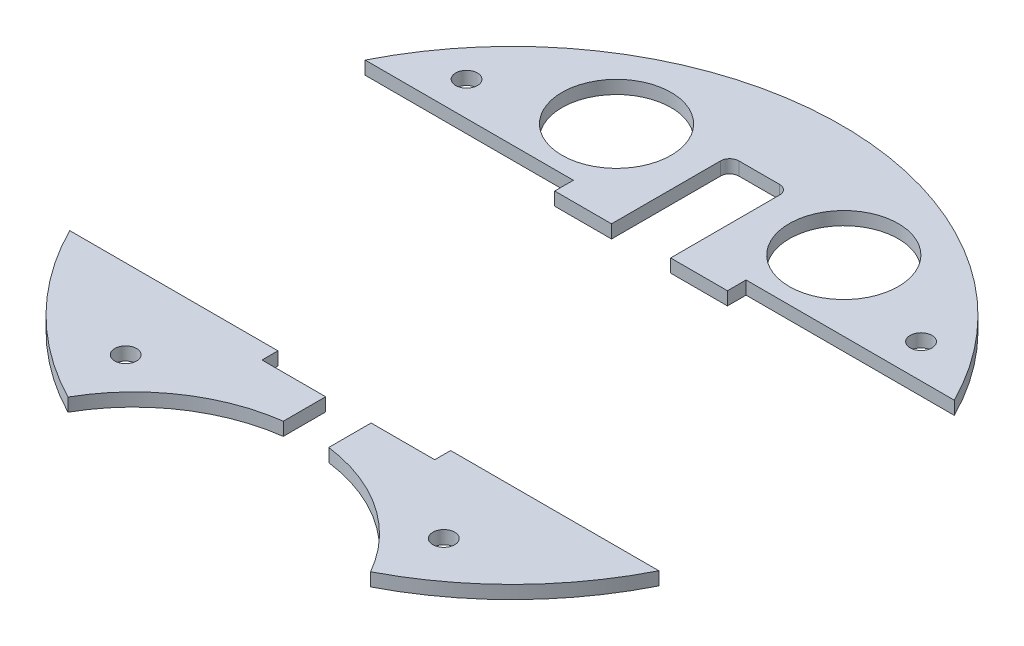
ISO-10303-21;
HEADER;
FILE_DESCRIPTION(('STEP AP214'),'2;1');
FILE_NAME('part.step','',(''),(''),'','','');
FILE_SCHEMA(('AUTOMOTIVE_DESIGN { 1 0 10303 214 1 1 1 1 }'));
ENDSEC;
DATA;
#1=APPLICATION_CONTEXT('core data for automotive mechanical design processes');
#2=APPLICATION_PROTOCOL_DEFINITION('international standard','automotive_design',2000,#1);
#3=PRODUCT_CONTEXT('',#1,'mechanical');
#4=PRODUCT('Part','Part','',(#3));
#5=PRODUCT_RELATED_PRODUCT_CATEGORY('part','',(#4));
#6=PRODUCT_DEFINITION_FORMATION('','',#4);
#7=PRODUCT_DEFINITION_CONTEXT('part definition',#1,'design');
#8=PRODUCT_DEFINITION('design','',#6,#7);
#9=PRODUCT_DEFINITION_SHAPE('','',#8);
#10=(LENGTH_UNIT() NAMED_UNIT(*) SI_UNIT(.MILLI.,.METRE.));
#11=(NAMED_UNIT(*) PLANE_ANGLE_UNIT() SI_UNIT($,.RADIAN.));
#12=(NAMED_UNIT(*) SI_UNIT($,.STERADIAN.) SOLID_ANGLE_UNIT());
#13=UNCERTAINTY_MEASURE_WITH_UNIT(LENGTH_MEASURE(1.E-05),#10,'distance_accuracy_value','');
#14=(GEOMETRIC_REPRESENTATION_CONTEXT(3) GLOBAL_UNCERTAINTY_ASSIGNED_CONTEXT((#13)) GLOBAL_UNIT_ASSIGNED_CONTEXT((#10,
#11,#12)) REPRESENTATION_CONTEXT('',''));
#15=CARTESIAN_POINT('',(0.,0.,0.));
#16=DIRECTION('',(0.,0.,1.));
#17=DIRECTION('',(1.,0.,0.));
#18=AXIS2_PLACEMENT_3D('',#15,#16,#17);
#19=CARTESIAN_POINT('',(0.,2.9,41.6198998188017));
#20=DIRECTION('',(0.,1.,0.));
#21=DIRECTION('',(0.,0.,1.));
#22=AXIS2_PLACEMENT_3D('',#19,#20,#21);
#23=PLANE('',#22);
#24=DIRECTION('',(0.,0.,1.));
#25=VECTOR('',#24,1.);
#26=CARTESIAN_POINT('',(-5.,2.9,41.6198998188017));
#27=LINE('',#26,#25);
#28=CARTESIAN_POINT('',(-5.,2.9,36.));
#29=VERTEX_POINT('',#28);
#30=CARTESIAN_POINT('',(-5.,2.9,45.3180051125549));
#31=VERTEX_POINT('',#30);
#32=EDGE_CURVE('E12',#29,#31,#27,.T.);
#33=ORIENTED_EDGE('',*,*,#32,.F.);
#34=DIRECTION('',(1.,0.,0.));
#35=VECTOR('',#34,1.);
#36=CARTESIAN_POINT('',(-19.,2.9,36.));
#37=LINE('',#36,#35);
#38=CARTESIAN_POINT('',(-19.,2.9,36.));
#39=VERTEX_POINT('',#38);
#40=EDGE_CURVE('E108',#39,#29,#37,.T.);
#41=ORIENTED_EDGE('',*,*,#40,.F.);
#42=DIRECTION('',(0.,0.,1.));
#43=VECTOR('',#42,1.);
#44=CARTESIAN_POINT('',(-19.,2.9,-28.4));
#45=LINE('',#44,#43);
#46=CARTESIAN_POINT('',(-19.,2.9,32.5));
#47=VERTEX_POINT('',#46);
#48=EDGE_CURVE('E149',#47,#39,#45,.T.);
#49=ORIENTED_EDGE('',*,*,#48,.F.);
#50=DIRECTION('',(1.,0.,0.));
#51=VECTOR('',#50,1.);
#52=CARTESIAN_POINT('',(-72.5,2.9,32.5));
#53=LINE('',#52,#51);
#54=CARTESIAN_POINT('',(-64.8074069840786,2.9,32.5));
#55=VERTEX_POINT('',#54);
#56=EDGE_CURVE('E52',#55,#47,#53,.T.);
#57=ORIENTED_EDGE('',*,*,#56,.F.);
#58=CARTESIAN_POINT('',(0.,2.9,0.));
#59=DIRECTION('',(0.,1.,0.));
#60=DIRECTION('',(0.,0.,1.));
#61=AXIS2_PLACEMENT_3D('',#58,#59,#60);
#62=CIRCLE('',#61,72.5);
#63=CARTESIAN_POINT('',(-33.2911053697012,2.9,64.4045984636458));
#64=VERTEX_POINT('',#63);
#65=EDGE_CURVE('E122',#55,#64,#62,.T.);
#66=ORIENTED_EDGE('',*,*,#65,.T.);
#67=CARTESIAN_POINT('',(0.,2.9,83.2397996376034));
#68=DIRECTION('',(0.,-1.,0.));
#69=DIRECTION('',(0.,0.,1.));
#70=AXIS2_PLACEMENT_3D('',#67,#68,#69);
#71=CIRCLE('',#70,38.25);
#72=EDGE_CURVE('E47',#64,#31,#71,.T.);
#73=ORIENTED_EDGE('',*,*,#72,.T.);
#74=EDGE_LOOP('',(#33,#41,#49,#57,#66,#73));
#75=FACE_BOUND('',#74,.T.);
#76=CARTESIAN_POINT('',(-35.,2.9,50.));
#77=DIRECTION('',(0.,1.,0.));
#78=DIRECTION('',(0.,0.,1.));
#79=AXIS2_PLACEMENT_3D('',#76,#77,#78);
#80=CIRCLE('',#79,2.4);
#81=CARTESIAN_POINT('',(-35.,2.9,52.4));
#82=VERTEX_POINT('',#81);
#83=EDGE_CURVE('E140',#82,#82,#80,.T.);
#84=ORIENTED_EDGE('',*,*,#83,.F.);
#85=EDGE_LOOP('',(#84));
#86=FACE_BOUND('',#85,.T.);
#87=ADVANCED_FACE('F44',(#75,#86),#23,.T.);
#88=CARTESIAN_POINT('',(0.,0.,41.6198998188017));
#89=DIRECTION('',(0.,1.,0.));
#90=DIRECTION('',(0.,0.,1.));
#91=AXIS2_PLACEMENT_3D('',#88,#89,#90);
#92=PLANE('',#91);
#93=CARTESIAN_POINT('',(-35.,0.,50.));
#94=DIRECTION('',(0.,1.,0.));
#95=DIRECTION('',(0.,0.,1.));
#96=AXIS2_PLACEMENT_3D('',#93,#94,#95);
#97=CIRCLE('',#96,2.4);
#98=CARTESIAN_POINT('',(-35.,0.,52.4));
#99=VERTEX_POINT('',#98);
#100=EDGE_CURVE('E116',#99,#99,#97,.T.);
#101=ORIENTED_EDGE('',*,*,#100,.T.);
#102=EDGE_LOOP('',(#101));
#103=FACE_BOUND('',#102,.T.);
#104=DIRECTION('',(1.,0.,0.));
#105=VECTOR('',#104,1.);
#106=CARTESIAN_POINT('',(-19.,0.,36.));
#107=LINE('',#106,#105);
#108=CARTESIAN_POINT('',(-19.,0.,36.));
#109=VERTEX_POINT('',#108);
#110=CARTESIAN_POINT('',(-5.00000000000001,0.,36.));
#111=VERTEX_POINT('',#110);
#112=EDGE_CURVE('E100',#109,#111,#107,.T.);
#113=ORIENTED_EDGE('',*,*,#112,.T.);
#114=DIRECTION('',(0.,0.,1.));
#115=VECTOR('',#114,1.);
#116=CARTESIAN_POINT('',(-5.00000000000001,0.,0.));
#117=LINE('',#116,#115);
#118=CARTESIAN_POINT('',(-5.,0.,45.3180051125549));
#119=VERTEX_POINT('',#118);
#120=EDGE_CURVE('E91',#111,#119,#117,.T.);
#121=ORIENTED_EDGE('',*,*,#120,.T.);
#122=CARTESIAN_POINT('',(0.,0.,83.2397996376034));
#123=DIRECTION('',(0.,-1.,0.));
#124=DIRECTION('',(0.,0.,1.));
#125=AXIS2_PLACEMENT_3D('',#122,#123,#124);
#126=CIRCLE('',#125,38.25);
#127=CARTESIAN_POINT('',(-33.2911053697012,0.,64.4045984636458));
#128=VERTEX_POINT('',#127);
#129=EDGE_CURVE('E134',#128,#119,#126,.T.);
#130=ORIENTED_EDGE('',*,*,#129,.F.);
#131=CARTESIAN_POINT('',(0.,0.,0.));
#132=DIRECTION('',(0.,1.,0.));
#133=DIRECTION('',(0.,0.,1.));
#134=AXIS2_PLACEMENT_3D('',#131,#132,#133);
#135=CIRCLE('',#134,72.5);
#136=CARTESIAN_POINT('',(-64.8074069840786,0.,32.5));
#137=VERTEX_POINT('',#136);
#138=EDGE_CURVE('E142',#137,#128,#135,.T.);
#139=ORIENTED_EDGE('',*,*,#138,.F.);
#140=DIRECTION('',(1.,0.,0.));
#141=VECTOR('',#140,1.);
#142=CARTESIAN_POINT('',(-72.5,0.,32.5));
#143=LINE('',#142,#141);
#144=CARTESIAN_POINT('',(-19.,0.,32.5));
#145=VERTEX_POINT('',#144);
#146=EDGE_CURVE('E99',#137,#145,#143,.T.);
#147=ORIENTED_EDGE('',*,*,#146,.T.);
#148=DIRECTION('',(0.,0.,1.));
#149=VECTOR('',#148,1.);
#150=CARTESIAN_POINT('',(-19.,0.,-28.4));
#151=LINE('',#150,#149);
#152=EDGE_CURVE('E114',#145,#109,#151,.T.);
#153=ORIENTED_EDGE('',*,*,#152,.T.);
#154=EDGE_LOOP('',(#113,#121,#130,#139,#147,#153));
#155=FACE_BOUND('',#154,.T.);
#156=ADVANCED_FACE('F111',(#103,#155),#92,.F.);
#157=CARTESIAN_POINT('',(0.,2.9,83.2397996376034));
#158=DIRECTION('',(0.,-1.,0.));
#159=DIRECTION('',(0.,0.,-1.));
#160=AXIS2_PLACEMENT_3D('',#157,#158,#159);
#161=CYLINDRICAL_SURFACE('',#160,38.25);
#162=ORIENTED_EDGE('',*,*,#129,.T.);
#163=DIRECTION('',(0.,-1.,0.));
#164=VECTOR('',#163,1.);
#165=CARTESIAN_POINT('',(-5.,2.9,45.3180051125549));
#166=LINE('',#165,#164);
#167=EDGE_CURVE('E59',#119,#31,#166,.F.);
#168=ORIENTED_EDGE('',*,*,#167,.T.);
#169=ORIENTED_EDGE('',*,*,#72,.F.);
#170=DIRECTION('',(0.,-1.,0.));
#171=VECTOR('',#170,1.);
#172=CARTESIAN_POINT('',(-33.2911053697012,2.9,64.4045984636458));
#173=LINE('',#172,#171);
#174=EDGE_CURVE('E133',#64,#128,#173,.T.);
#175=ORIENTED_EDGE('',*,*,#174,.T.);
#176=EDGE_LOOP('',(#162,#168,#169,#175));
#177=FACE_BOUND('',#176,.T.);
#178=ADVANCED_FACE('F132',(#177),#161,.F.);
#179=CARTESIAN_POINT('',(-19.,0.,36.));
#180=DIRECTION('',(0.,0.,1.));
#181=DIRECTION('',(1.,0.,0.));
#182=AXIS2_PLACEMENT_3D('',#179,#180,#181);
#183=PLANE('',#182);
#184=ORIENTED_EDGE('',*,*,#40,.T.);
#185=DIRECTION('',(0.,-1.,0.));
#186=VECTOR('',#185,1.);
#187=CARTESIAN_POINT('',(-5.,0.,36.));
#188=LINE('',#187,#186);
#189=EDGE_CURVE('E94',#29,#111,#188,.T.);
#190=ORIENTED_EDGE('',*,*,#189,.T.);
#191=ORIENTED_EDGE('',*,*,#112,.F.);
#192=DIRECTION('',(0.,1.,0.));
#193=VECTOR('',#192,1.);
#194=CARTESIAN_POINT('',(-19.,0.,36.));
#195=LINE('',#194,#193);
#196=EDGE_CURVE('E109',#109,#39,#195,.T.);
#197=ORIENTED_EDGE('',*,*,#196,.T.);
#198=EDGE_LOOP('',(#184,#190,#191,#197));
#199=FACE_BOUND('',#198,.T.);
#200=ADVANCED_FACE('F105',(#199),#183,.F.);
#201=CARTESIAN_POINT('',(0.,2.9,0.));
#202=DIRECTION('',(0.,-1.,0.));
#203=DIRECTION('',(0.,0.,-1.));
#204=AXIS2_PLACEMENT_3D('',#201,#202,#203);
#205=CYLINDRICAL_SURFACE('',#204,72.5);
#206=ORIENTED_EDGE('',*,*,#65,.F.);
#207=DIRECTION('',(0.,-1.,0.));
#208=VECTOR('',#207,1.);
#209=CARTESIAN_POINT('',(-64.8074069840786,2.9,32.5));
#210=LINE('',#209,#208);
#211=EDGE_CURVE('E144',#55,#137,#210,.T.);
#212=ORIENTED_EDGE('',*,*,#211,.T.);
#213=ORIENTED_EDGE('',*,*,#138,.T.);
#214=ORIENTED_EDGE('',*,*,#174,.F.);
#215=EDGE_LOOP('',(#206,#212,#213,#214));
#216=FACE_BOUND('',#215,.T.);
#217=ADVANCED_FACE('F160',(#216),#205,.T.);
#218=CARTESIAN_POINT('',(-19.,0.,-28.4));
#219=DIRECTION('',(-1.,0.,0.));
#220=DIRECTION('',(0.,0.,1.));
#221=AXIS2_PLACEMENT_3D('',#218,#219,#220);
#222=PLANE('',#221);
#223=ORIENTED_EDGE('',*,*,#152,.F.);
#224=DIRECTION('',(0.,1.,0.));
#225=VECTOR('',#224,1.);
#226=CARTESIAN_POINT('',(-19.,0.,32.5));
#227=LINE('',#226,#225);
#228=EDGE_CURVE('E143',#145,#47,#227,.T.);
#229=ORIENTED_EDGE('',*,*,#228,.T.);
#230=ORIENTED_EDGE('',*,*,#48,.T.);
#231=ORIENTED_EDGE('',*,*,#196,.F.);
#232=EDGE_LOOP('',(#223,#229,#230,#231));
#233=FACE_BOUND('',#232,.T.);
#234=ADVANCED_FACE('F158',(#233),#222,.F.);
#235=CARTESIAN_POINT('',(-35.,0.,50.));
#236=DIRECTION('',(0.,1.,0.));
#237=DIRECTION('',(0.,0.,1.));
#238=AXIS2_PLACEMENT_3D('',#235,#236,#237);
#239=CYLINDRICAL_SURFACE('',#238,2.4);
#240=ORIENTED_EDGE('',*,*,#100,.F.);
#241=EDGE_LOOP('',(#240));
#242=FACE_BOUND('',#241,.T.);
#243=ORIENTED_EDGE('',*,*,#83,.T.);
#244=EDGE_LOOP('',(#243));
#245=FACE_BOUND('',#244,.T.);
#246=ADVANCED_FACE('F167',(#242,#245),#239,.F.);
#247=CARTESIAN_POINT('',(-72.5,0.,32.5));
#248=DIRECTION('',(0.,0.,1.));
#249=DIRECTION('',(1.,0.,0.));
#250=AXIS2_PLACEMENT_3D('',#247,#248,#249);
#251=PLANE('',#250);
#252=ORIENTED_EDGE('',*,*,#56,.T.);
#253=ORIENTED_EDGE('',*,*,#228,.F.);
#254=ORIENTED_EDGE('',*,*,#146,.F.);
#255=ORIENTED_EDGE('',*,*,#211,.F.);
#256=EDGE_LOOP('',(#252,#253,#254,#255));
#257=FACE_BOUND('',#256,.T.);
#258=ADVANCED_FACE('F184',(#257),#251,.F.);
#259=CARTESIAN_POINT('',(-5.00000000000001,0.,0.));
#260=DIRECTION('',(-1.,0.,0.));
#261=DIRECTION('',(0.,0.,1.));
#262=AXIS2_PLACEMENT_3D('',#259,#260,#261);
#263=PLANE('',#262);
#264=ORIENTED_EDGE('',*,*,#120,.F.);
#265=ORIENTED_EDGE('',*,*,#189,.F.);
#266=ORIENTED_EDGE('',*,*,#32,.T.);
#267=ORIENTED_EDGE('',*,*,#167,.F.);
#268=EDGE_LOOP('',(#264,#265,#266,#267));
#269=FACE_BOUND('',#268,.T.);
#270=ADVANCED_FACE('F93',(#269),#263,.F.);
#271=CLOSED_SHELL('',(#87,#156,#178,#200,#217,#234,#246,#258,#270));
#272=MANIFOLD_SOLID_BREP('B2',#271);
#273=CARTESIAN_POINT('',(-72.5,0.,32.5));
#274=DIRECTION('',(0.,0.,1.));
#275=DIRECTION('',(1.,0.,0.));
#276=AXIS2_PLACEMENT_3D('',#273,#274,#275);
#277=PLANE('',#276);
#278=DIRECTION('',(1.,0.,0.));
#279=VECTOR('',#278,1.);
#280=CARTESIAN_POINT('',(-72.5,0.,32.5));
#281=LINE('',#280,#279);
#282=CARTESIAN_POINT('',(19.,0.,32.5));
#283=VERTEX_POINT('',#282);
#284=CARTESIAN_POINT('',(64.8074069840786,0.,32.5));
#285=VERTEX_POINT('',#284);
#286=EDGE_CURVE('E286',#283,#285,#281,.T.);
#287=ORIENTED_EDGE('',*,*,#286,.F.);
#288=DIRECTION('',(0.,-1.,0.));
#289=VECTOR('',#288,1.);
#290=CARTESIAN_POINT('',(19.,0.,32.5));
#291=LINE('',#290,#289);
#292=CARTESIAN_POINT('',(19.,2.9,32.5));
#293=VERTEX_POINT('',#292);
#294=EDGE_CURVE('E283',#293,#283,#291,.T.);
#295=ORIENTED_EDGE('',*,*,#294,.F.);
#296=DIRECTION('',(1.,0.,0.));
#297=VECTOR('',#296,1.);
#298=CARTESIAN_POINT('',(-72.5,2.9,32.5));
#299=LINE('',#298,#297);
#300=CARTESIAN_POINT('',(64.8074069840786,2.9,32.5));
#301=VERTEX_POINT('',#300);
#302=EDGE_CURVE('E258',#293,#301,#299,.T.);
#303=ORIENTED_EDGE('',*,*,#302,.T.);
#304=DIRECTION('',(0.,-1.,0.));
#305=VECTOR('',#304,1.);
#306=CARTESIAN_POINT('',(64.8074069840786,2.9,32.5));
#307=LINE('',#306,#305);
#308=EDGE_CURVE('E273',#285,#301,#307,.F.);
#309=ORIENTED_EDGE('',*,*,#308,.F.);
#310=EDGE_LOOP('',(#287,#295,#303,#309));
#311=FACE_BOUND('',#310,.T.);
#312=ADVANCED_FACE('F250',(#311),#277,.F.);
#313=CARTESIAN_POINT('',(35.,0.,50.));
#314=DIRECTION('',(0.,1.,0.));
#315=DIRECTION('',(0.,0.,1.));
#316=AXIS2_PLACEMENT_3D('',#313,#314,#315);
#317=CYLINDRICAL_SURFACE('',#316,2.4);
#318=CARTESIAN_POINT('',(35.,0.,50.));
#319=DIRECTION('',(0.,1.,0.));
#320=DIRECTION('',(0.,0.,1.));
#321=AXIS2_PLACEMENT_3D('',#318,#319,#320);
#322=CIRCLE('',#321,2.4);
#323=CARTESIAN_POINT('',(35.,0.,52.3999999999999));
#324=VERTEX_POINT('',#323);
#325=EDGE_CURVE('E317',#324,#324,#322,.T.);
#326=ORIENTED_EDGE('',*,*,#325,.F.);
#327=EDGE_LOOP('',(#326));
#328=FACE_BOUND('',#327,.T.);
#329=CARTESIAN_POINT('',(35.,2.9,50.));
#330=DIRECTION('',(0.,1.,0.));
#331=DIRECTION('',(0.,0.,1.));
#332=AXIS2_PLACEMENT_3D('',#329,#330,#331);
#333=CIRCLE('',#332,2.4);
#334=CARTESIAN_POINT('',(35.,2.9,52.3999999999999));
#335=VERTEX_POINT('',#334);
#336=EDGE_CURVE('E338',#335,#335,#333,.T.);
#337=ORIENTED_EDGE('',*,*,#336,.T.);
#338=EDGE_LOOP('',(#337));
#339=FACE_BOUND('',#338,.T.);
#340=ADVANCED_FACE('F363',(#328,#339),#317,.F.);
#341=CARTESIAN_POINT('',(0.,2.9,0.));
#342=DIRECTION('',(0.,-1.,0.));
#343=DIRECTION('',(0.,0.,-1.));
#344=AXIS2_PLACEMENT_3D('',#341,#342,#343);
#345=CYLINDRICAL_SURFACE('',#344,72.5);
#346=CARTESIAN_POINT('',(0.,0.,0.));
#347=DIRECTION('',(0.,1.,0.));
#348=DIRECTION('',(0.,0.,1.));
#349=AXIS2_PLACEMENT_3D('',#346,#347,#348);
#350=CIRCLE('',#349,72.5);
#351=CARTESIAN_POINT('',(33.2911053697012,0.,64.4045984636458));
#352=VERTEX_POINT('',#351);
#353=EDGE_CURVE('E327',#352,#285,#350,.T.);
#354=ORIENTED_EDGE('',*,*,#353,.T.);
#355=ORIENTED_EDGE('',*,*,#308,.T.);
#356=CARTESIAN_POINT('',(0.,2.9,0.));
#357=DIRECTION('',(0.,1.,0.));
#358=DIRECTION('',(0.,0.,1.));
#359=AXIS2_PLACEMENT_3D('',#356,#357,#358);
#360=CIRCLE('',#359,72.5);
#361=CARTESIAN_POINT('',(33.2911053697012,2.9,64.4045984636458));
#362=VERTEX_POINT('',#361);
#363=EDGE_CURVE('E306',#362,#301,#360,.T.);
#364=ORIENTED_EDGE('',*,*,#363,.F.);
#365=DIRECTION('',(0.,-1.,0.));
#366=VECTOR('',#365,1.);
#367=CARTESIAN_POINT('',(33.2911053697012,2.9,64.4045984636458));
#368=LINE('',#367,#366);
#369=EDGE_CURVE('E316',#362,#352,#368,.T.);
#370=ORIENTED_EDGE('',*,*,#369,.T.);
#371=EDGE_LOOP('',(#354,#355,#364,#370));
#372=FACE_BOUND('',#371,.T.);
#373=ADVANCED_FACE('F252',(#372),#345,.T.);
#374=CARTESIAN_POINT('',(19.,0.,36.));
#375=DIRECTION('',(1.,0.,0.));
#376=DIRECTION('',(0.,0.,-1.));
#377=AXIS2_PLACEMENT_3D('',#374,#375,#376);
#378=PLANE('',#377);
#379=DIRECTION('',(0.,0.,-1.));
#380=VECTOR('',#379,1.);
#381=CARTESIAN_POINT('',(19.,2.9,36.));
#382=LINE('',#381,#380);
#383=CARTESIAN_POINT('',(19.,2.9,36.));
#384=VERTEX_POINT('',#383);
#385=EDGE_CURVE('E323',#384,#293,#382,.T.);
#386=ORIENTED_EDGE('',*,*,#385,.T.);
#387=ORIENTED_EDGE('',*,*,#294,.T.);
#388=DIRECTION('',(0.,0.,-1.));
#389=VECTOR('',#388,1.);
#390=CARTESIAN_POINT('',(19.,0.,36.));
#391=LINE('',#390,#389);
#392=CARTESIAN_POINT('',(19.,0.,36.));
#393=VERTEX_POINT('',#392);
#394=EDGE_CURVE('E339',#393,#283,#391,.T.);
#395=ORIENTED_EDGE('',*,*,#394,.F.);
#396=DIRECTION('',(0.,1.,0.));
#397=VECTOR('',#396,1.);
#398=CARTESIAN_POINT('',(19.,0.,36.));
#399=LINE('',#398,#397);
#400=EDGE_CURVE('E333',#393,#384,#399,.T.);
#401=ORIENTED_EDGE('',*,*,#400,.T.);
#402=EDGE_LOOP('',(#386,#387,#395,#401));
#403=FACE_BOUND('',#402,.T.);
#404=ADVANCED_FACE('F357',(#403),#378,.F.);
#405=CARTESIAN_POINT('',(-19.,0.,36.));
#406=DIRECTION('',(0.,0.,1.));
#407=DIRECTION('',(1.,0.,0.));
#408=AXIS2_PLACEMENT_3D('',#405,#406,#407);
#409=PLANE('',#408);
#410=DIRECTION('',(1.,0.,0.));
#411=VECTOR('',#410,1.);
#412=CARTESIAN_POINT('',(-19.,0.,36.));
#413=LINE('',#412,#411);
#414=CARTESIAN_POINT('',(5.,0.,36.));
#415=VERTEX_POINT('',#414);
#416=EDGE_CURVE('E342',#415,#393,#413,.T.);
#417=ORIENTED_EDGE('',*,*,#416,.F.);
#418=DIRECTION('',(0.,1.,0.));
#419=VECTOR('',#418,1.);
#420=CARTESIAN_POINT('',(5.,0.,36.));
#421=LINE('',#420,#419);
#422=CARTESIAN_POINT('',(5.,2.9,36.));
#423=VERTEX_POINT('',#422);
#424=EDGE_CURVE('E42',#415,#423,#421,.T.);
#425=ORIENTED_EDGE('',*,*,#424,.T.);
#426=DIRECTION('',(1.,0.,0.));
#427=VECTOR('',#426,1.);
#428=CARTESIAN_POINT('',(-19.,2.9,36.));
#429=LINE('',#428,#427);
#430=EDGE_CURVE('E335',#423,#384,#429,.T.);
#431=ORIENTED_EDGE('',*,*,#430,.T.);
#432=ORIENTED_EDGE('',*,*,#400,.F.);
#433=EDGE_LOOP('',(#417,#425,#431,#432));
#434=FACE_BOUND('',#433,.T.);
#435=ADVANCED_FACE('F360',(#434),#409,.F.);
#436=CARTESIAN_POINT('',(0.,2.9,83.2397996376034));
#437=DIRECTION('',(0.,-1.,0.));
#438=DIRECTION('',(0.,0.,-1.));
#439=AXIS2_PLACEMENT_3D('',#436,#437,#438);
#440=CYLINDRICAL_SURFACE('',#439,38.25);
#441=CARTESIAN_POINT('',(0.,2.9,83.2397996376034));
#442=DIRECTION('',(0.,-1.,0.));
#443=DIRECTION('',(0.,0.,1.));
#444=AXIS2_PLACEMENT_3D('',#441,#442,#443);
#445=CIRCLE('',#444,38.25);
#446=CARTESIAN_POINT('',(5.,2.9,45.3180051125549));
#447=VERTEX_POINT('',#446);
#448=EDGE_CURVE('E302',#447,#362,#445,.T.);
#449=ORIENTED_EDGE('',*,*,#448,.F.);
#450=DIRECTION('',(0.,-1.,0.));
#451=VECTOR('',#450,1.);
#452=CARTESIAN_POINT('',(5.,2.9,45.3180051125549));
#453=LINE('',#452,#451);
#454=CARTESIAN_POINT('',(5.,0.,45.3180051125549));
#455=VERTEX_POINT('',#454);
#456=EDGE_CURVE('E311',#447,#455,#453,.T.);
#457=ORIENTED_EDGE('',*,*,#456,.T.);
#458=CARTESIAN_POINT('',(0.,0.,83.2397996376034));
#459=DIRECTION('',(0.,-1.,0.));
#460=DIRECTION('',(0.,0.,1.));
#461=AXIS2_PLACEMENT_3D('',#458,#459,#460);
#462=CIRCLE('',#461,38.25);
#463=EDGE_CURVE('E321',#455,#352,#462,.T.);
#464=ORIENTED_EDGE('',*,*,#463,.T.);
#465=ORIENTED_EDGE('',*,*,#369,.F.);
#466=EDGE_LOOP('',(#449,#457,#464,#465));
#467=FACE_BOUND('',#466,.T.);
#468=ADVANCED_FACE('F319',(#467),#440,.F.);
#469=CARTESIAN_POINT('',(0.,0.,41.6198998188017));
#470=DIRECTION('',(0.,1.,0.));
#471=DIRECTION('',(0.,0.,1.));
#472=AXIS2_PLACEMENT_3D('',#469,#470,#471);
#473=PLANE('',#472);
#474=ORIENTED_EDGE('',*,*,#325,.T.);
#475=EDGE_LOOP('',(#474));
#476=FACE_BOUND('',#475,.T.);
#477=ORIENTED_EDGE('',*,*,#463,.F.);
#478=DIRECTION('',(0.,0.,-1.));
#479=VECTOR('',#478,1.);
#480=CARTESIAN_POINT('',(5.,0.,62.802486990222));
#481=LINE('',#480,#479);
#482=EDGE_CURVE('E440',#455,#415,#481,.T.);
#483=ORIENTED_EDGE('',*,*,#482,.T.);
#484=ORIENTED_EDGE('',*,*,#416,.T.);
#485=ORIENTED_EDGE('',*,*,#394,.T.);
#486=ORIENTED_EDGE('',*,*,#286,.T.);
#487=ORIENTED_EDGE('',*,*,#353,.F.);
#488=EDGE_LOOP('',(#477,#483,#484,#485,#486,#487));
#489=FACE_BOUND('',#488,.T.);
#490=ADVANCED_FACE('F350',(#476,#489),#473,.F.);
#491=CARTESIAN_POINT('',(0.,2.9,41.6198998188017));
#492=DIRECTION('',(0.,1.,0.));
#493=DIRECTION('',(0.,0.,1.));
#494=AXIS2_PLACEMENT_3D('',#491,#492,#493);
#495=PLANE('',#494);
#496=DIRECTION('',(0.,0.,-1.));
#497=VECTOR('',#496,1.);
#498=CARTESIAN_POINT('',(5.,2.9,41.6198998188017));
#499=LINE('',#498,#497);
#500=EDGE_CURVE('E265',#447,#423,#499,.T.);
#501=ORIENTED_EDGE('',*,*,#500,.F.);
#502=ORIENTED_EDGE('',*,*,#448,.T.);
#503=ORIENTED_EDGE('',*,*,#363,.T.);
#504=ORIENTED_EDGE('',*,*,#302,.F.);
#505=ORIENTED_EDGE('',*,*,#385,.F.);
#506=ORIENTED_EDGE('',*,*,#430,.F.);
#507=EDGE_LOOP('',(#501,#502,#503,#504,#505,#506));
#508=FACE_BOUND('',#507,.T.);
#509=ORIENTED_EDGE('',*,*,#336,.F.);
#510=EDGE_LOOP('',(#509));
#511=FACE_BOUND('',#510,.T.);
#512=ADVANCED_FACE('F304',(#508,#511),#495,.T.);
#513=CARTESIAN_POINT('',(5.,0.,62.802486990222));
#514=DIRECTION('',(1.,0.,0.));
#515=DIRECTION('',(0.,0.,-1.));
#516=AXIS2_PLACEMENT_3D('',#513,#514,#515);
#517=PLANE('',#516);
#518=ORIENTED_EDGE('',*,*,#500,.T.);
#519=ORIENTED_EDGE('',*,*,#424,.F.);
#520=ORIENTED_EDGE('',*,*,#482,.F.);
#521=ORIENTED_EDGE('',*,*,#456,.F.);
#522=EDGE_LOOP('',(#518,#519,#520,#521));
#523=FACE_BOUND('',#522,.T.);
#524=ADVANCED_FACE('F375',(#523),#517,.F.);
#525=CLOSED_SHELL('',(#312,#340,#373,#404,#435,#468,#490,#512,#524));
#526=MANIFOLD_SOLID_BREP('B6',#525);
#527=CARTESIAN_POINT('',(-4.5,0.,-52.4));
#528=DIRECTION('',(0.,1.,0.));
#529=DIRECTION('',(0.,0.,1.));
#530=AXIS2_PLACEMENT_3D('',#527,#528,#529);
#531=CYLINDRICAL_SURFACE('',#530,2.);
#532=CARTESIAN_POINT('',(-4.5,2.9,-52.4));
#533=DIRECTION('',(0.,1.,0.));
#534=DIRECTION('',(0.,0.,1.));
#535=AXIS2_PLACEMENT_3D('',#532,#533,#534);
#536=CIRCLE('',#535,2.);
#537=CARTESIAN_POINT('',(-4.49999999999999,2.9,-54.4));
#538=VERTEX_POINT('',#537);
#539=CARTESIAN_POINT('',(-6.50000000000001,2.9,-52.4));
#540=VERTEX_POINT('',#539);
#541=EDGE_CURVE('E608',#538,#540,#536,.T.);
#542=ORIENTED_EDGE('',*,*,#541,.T.);
#543=DIRECTION('',(0.,1.,0.));
#544=VECTOR('',#543,1.);
#545=CARTESIAN_POINT('',(-6.50000000000001,0.,-52.4));
#546=LINE('',#545,#544);
#547=CARTESIAN_POINT('',(-6.50000000000001,0.,-52.4));
#548=VERTEX_POINT('',#547);
#549=EDGE_CURVE('E631',#548,#540,#546,.T.);
#550=ORIENTED_EDGE('',*,*,#549,.F.);
#551=CARTESIAN_POINT('',(-4.5,0.,-52.4));
#552=DIRECTION('',(0.,1.,0.));
#553=DIRECTION('',(0.,0.,1.));
#554=AXIS2_PLACEMENT_3D('',#551,#552,#553);
#555=CIRCLE('',#554,2.);
#556=CARTESIAN_POINT('',(-4.49999999999999,0.,-54.4));
#557=VERTEX_POINT('',#556);
#558=EDGE_CURVE('E616',#557,#548,#555,.T.);
#559=ORIENTED_EDGE('',*,*,#558,.F.);
#560=DIRECTION('',(0.,1.,0.));
#561=VECTOR('',#560,1.);
#562=CARTESIAN_POINT('',(-4.49999999999999,0.,-54.4));
#563=LINE('',#562,#561);
#564=EDGE_CURVE('E634',#557,#538,#563,.T.);
#565=ORIENTED_EDGE('',*,*,#564,.T.);
#566=EDGE_LOOP('',(#542,#550,#559,#565));
#567=FACE_BOUND('',#566,.T.);
#568=ADVANCED_FACE('F447',(#567),#531,.F.);
#569=CARTESIAN_POINT('',(4.49999999999998,0.,-54.4));
#570=DIRECTION('',(0.,0.,-1.));
#571=DIRECTION('',(-1.,0.,0.));
#572=AXIS2_PLACEMENT_3D('',#569,#570,#571);
#573=PLANE('',#572);
#574=DIRECTION('',(-1.,0.,0.));
#575=VECTOR('',#574,1.);
#576=CARTESIAN_POINT('',(4.49999999999998,2.9,-54.4));
#577=LINE('',#576,#575);
#578=CARTESIAN_POINT('',(4.49999999999998,2.9,-54.4));
#579=VERTEX_POINT('',#578);
#580=EDGE_CURVE('E626',#579,#538,#577,.T.);
#581=ORIENTED_EDGE('',*,*,#580,.T.);
#582=ORIENTED_EDGE('',*,*,#564,.F.);
#583=DIRECTION('',(-1.,0.,0.));
#584=VECTOR('',#583,1.);
#585=CARTESIAN_POINT('',(4.49999999999998,0.,-54.4));
#586=LINE('',#585,#584);
#587=CARTESIAN_POINT('',(4.49999999999998,0.,-54.4));
#588=VERTEX_POINT('',#587);
#589=EDGE_CURVE('E613',#588,#557,#586,.T.);
#590=ORIENTED_EDGE('',*,*,#589,.F.);
#591=DIRECTION('',(0.,1.,0.));
#592=VECTOR('',#591,1.);
#593=CARTESIAN_POINT('',(4.49999999999998,0.,-54.4));
#594=LINE('',#593,#592);
#595=EDGE_CURVE('E636',#588,#579,#594,.T.);
#596=ORIENTED_EDGE('',*,*,#595,.T.);
#597=EDGE_LOOP('',(#581,#582,#590,#596));
#598=FACE_BOUND('',#597,.T.);
#599=ADVANCED_FACE('F663',(#598),#573,.F.);
#600=CARTESIAN_POINT('',(4.5,0.,-52.4));
#601=DIRECTION('',(0.,1.,0.));
#602=DIRECTION('',(0.,0.,1.));
#603=AXIS2_PLACEMENT_3D('',#600,#601,#602);
#604=CYLINDRICAL_SURFACE('',#603,2.);
#605=CARTESIAN_POINT('',(4.5,2.9,-52.4));
#606=DIRECTION('',(0.,1.,0.));
#607=DIRECTION('',(0.,0.,1.));
#608=AXIS2_PLACEMENT_3D('',#605,#606,#607);
#609=CIRCLE('',#608,2.);
#610=CARTESIAN_POINT('',(6.5,2.9,-52.4));
#611=VERTEX_POINT('',#610);
#612=EDGE_CURVE('E623',#611,#579,#609,.T.);
#613=ORIENTED_EDGE('',*,*,#612,.T.);
#614=ORIENTED_EDGE('',*,*,#595,.F.);
#615=CARTESIAN_POINT('',(4.5,0.,-52.4));
#616=DIRECTION('',(0.,1.,0.));
#617=DIRECTION('',(0.,0.,1.));
#618=AXIS2_PLACEMENT_3D('',#615,#616,#617);
#619=CIRCLE('',#618,2.);
#620=CARTESIAN_POINT('',(6.5,0.,-52.4));
#621=VERTEX_POINT('',#620);
#622=EDGE_CURVE('E610',#621,#588,#619,.T.);
#623=ORIENTED_EDGE('',*,*,#622,.F.);
#624=DIRECTION('',(0.,1.,0.));
#625=VECTOR('',#624,1.);
#626=CARTESIAN_POINT('',(6.5,0.,-52.4));
#627=LINE('',#626,#625);
#628=EDGE_CURVE('E619',#621,#611,#627,.T.);
#629=ORIENTED_EDGE('',*,*,#628,.T.);
#630=EDGE_LOOP('',(#613,#614,#623,#629));
#631=FACE_BOUND('',#630,.T.);
#632=ADVANCED_FACE('F659',(#631),#604,.F.);
#633=CARTESIAN_POINT('',(-25.,0.,-48.));
#634=DIRECTION('',(0.,1.,0.));
#635=DIRECTION('',(0.,0.,1.));
#636=AXIS2_PLACEMENT_3D('',#633,#634,#635);
#637=CYLINDRICAL_SURFACE('',#636,12.);
#638=CARTESIAN_POINT('',(-25.,0.,-48.));
#639=DIRECTION('',(0.,1.,0.));
#640=DIRECTION('',(0.,0.,1.));
#641=AXIS2_PLACEMENT_3D('',#638,#639,#640);
#642=CIRCLE('',#641,12.);
#643=CARTESIAN_POINT('',(-25.,0.,-36.));
#644=VERTEX_POINT('',#643);
#645=EDGE_CURVE('E599',#644,#644,#642,.T.);
#646=ORIENTED_EDGE('',*,*,#645,.F.);
#647=EDGE_LOOP('',(#646));
#648=FACE_BOUND('',#647,.T.);
#649=CARTESIAN_POINT('',(-25.,2.9,-48.));
#650=DIRECTION('',(0.,1.,0.));
#651=DIRECTION('',(0.,0.,1.));
#652=AXIS2_PLACEMENT_3D('',#649,#650,#651);
#653=CIRCLE('',#652,12.);
#654=CARTESIAN_POINT('',(-25.,2.9,-36.));
#655=VERTEX_POINT('',#654);
#656=EDGE_CURVE('E596',#655,#655,#653,.T.);
#657=ORIENTED_EDGE('',*,*,#656,.T.);
#658=EDGE_LOOP('',(#657));
#659=FACE_BOUND('',#658,.T.);
#660=ADVANCED_FACE('F706',(#648,#659),#637,.F.);
#661=CARTESIAN_POINT('',(25.,0.,-48.));
#662=DIRECTION('',(0.,1.,0.));
#663=DIRECTION('',(0.,0.,1.));
#664=AXIS2_PLACEMENT_3D('',#661,#662,#663);
#665=CYLINDRICAL_SURFACE('',#664,12.);
#666=CARTESIAN_POINT('',(25.,0.,-48.));
#667=DIRECTION('',(0.,1.,0.));
#668=DIRECTION('',(0.,0.,1.));
#669=AXIS2_PLACEMENT_3D('',#666,#667,#668);
#670=CIRCLE('',#669,12.);
#671=CARTESIAN_POINT('',(25.,0.,-36.));
#672=VERTEX_POINT('',#671);
#673=EDGE_CURVE('E593',#672,#672,#670,.T.);
#674=ORIENTED_EDGE('',*,*,#673,.F.);
#675=EDGE_LOOP('',(#674));
#676=FACE_BOUND('',#675,.T.);
#677=CARTESIAN_POINT('',(25.,2.9,-48.));
#678=DIRECTION('',(0.,1.,0.));
#679=DIRECTION('',(0.,0.,1.));
#680=AXIS2_PLACEMENT_3D('',#677,#678,#679);
#681=CIRCLE('',#680,12.);
#682=CARTESIAN_POINT('',(25.,2.9,-36.));
#683=VERTEX_POINT('',#682);
#684=EDGE_CURVE('E584',#683,#683,#681,.T.);
#685=ORIENTED_EDGE('',*,*,#684,.T.);
#686=EDGE_LOOP('',(#685));
#687=FACE_BOUND('',#686,.T.);
#688=ADVANCED_FACE('F712',(#676,#687),#665,.F.);
#689=CARTESIAN_POINT('',(50.,0.,-40.));
#690=DIRECTION('',(0.,1.,0.));
#691=DIRECTION('',(0.,0.,1.));
#692=AXIS2_PLACEMENT_3D('',#689,#690,#691);
#693=CYLINDRICAL_SURFACE('',#692,2.4);
#694=CARTESIAN_POINT('',(50.,0.,-40.));
#695=DIRECTION('',(0.,1.,0.));
#696=DIRECTION('',(0.,0.,1.));
#697=AXIS2_PLACEMENT_3D('',#694,#695,#696);
#698=CIRCLE('',#697,2.4);
#699=CARTESIAN_POINT('',(50.,0.,-37.6));
#700=VERTEX_POINT('',#699);
#701=EDGE_CURVE('E588',#700,#700,#698,.T.);
#702=ORIENTED_EDGE('',*,*,#701,.F.);
#703=EDGE_LOOP('',(#702));
#704=FACE_BOUND('',#703,.T.);
#705=CARTESIAN_POINT('',(50.,2.9,-40.));
#706=DIRECTION('',(0.,1.,0.));
#707=DIRECTION('',(0.,0.,1.));
#708=AXIS2_PLACEMENT_3D('',#705,#706,#707);
#709=CIRCLE('',#708,2.4);
#710=CARTESIAN_POINT('',(50.,2.9,-37.6));
#711=VERTEX_POINT('',#710);
#712=EDGE_CURVE('E580',#711,#711,#709,.T.);
#713=ORIENTED_EDGE('',*,*,#712,.T.);
#714=EDGE_LOOP('',(#713));
#715=FACE_BOUND('',#714,.T.);
#716=ADVANCED_FACE('F717',(#704,#715),#693,.F.);
#717=CARTESIAN_POINT('',(-50.,0.,-40.));
#718=DIRECTION('',(0.,1.,0.));
#719=DIRECTION('',(0.,0.,1.));
#720=AXIS2_PLACEMENT_3D('',#717,#718,#719);
#721=CYLINDRICAL_SURFACE('',#720,2.4);
#722=CARTESIAN_POINT('',(-50.,0.,-40.));
#723=DIRECTION('',(0.,1.,0.));
#724=DIRECTION('',(0.,0.,1.));
#725=AXIS2_PLACEMENT_3D('',#722,#723,#724);
#726=CIRCLE('',#725,2.4);
#727=CARTESIAN_POINT('',(-50.,0.,-37.6));
#728=VERTEX_POINT('',#727);
#729=EDGE_CURVE('E581',#728,#728,#726,.T.);
#730=ORIENTED_EDGE('',*,*,#729,.F.);
#731=EDGE_LOOP('',(#730));
#732=FACE_BOUND('',#731,.T.);
#733=CARTESIAN_POINT('',(-50.,2.9,-40.));
#734=DIRECTION('',(0.,1.,0.));
#735=DIRECTION('',(0.,0.,1.));
#736=AXIS2_PLACEMENT_3D('',#733,#734,#735);
#737=CIRCLE('',#736,2.4);
#738=CARTESIAN_POINT('',(-50.,2.9,-37.6));
#739=VERTEX_POINT('',#738);
#740=EDGE_CURVE('E585',#739,#739,#737,.T.);
#741=ORIENTED_EDGE('',*,*,#740,.T.);
#742=EDGE_LOOP('',(#741));
#743=FACE_BOUND('',#742,.T.);
#744=ADVANCED_FACE('F696',(#732,#743),#721,.F.);
#745=CARTESIAN_POINT('',(-6.50000000000001,0.,-52.4));
#746=DIRECTION('',(-1.,0.,0.));
#747=DIRECTION('',(0.,0.,1.));
#748=AXIS2_PLACEMENT_3D('',#745,#746,#747);
#749=PLANE('',#748);
#750=DIRECTION('',(0.,0.,1.));
#751=VECTOR('',#750,1.);
#752=CARTESIAN_POINT('',(-6.50000000000001,0.,-52.4));
#753=LINE('',#752,#751);
#754=CARTESIAN_POINT('',(-6.5,0.,-28.4));
#755=VERTEX_POINT('',#754);
#756=EDGE_CURVE('E605',#548,#755,#753,.T.);
#757=ORIENTED_EDGE('',*,*,#756,.F.);
#758=ORIENTED_EDGE('',*,*,#549,.T.);
#759=DIRECTION('',(0.,0.,1.));
#760=VECTOR('',#759,1.);
#761=CARTESIAN_POINT('',(-6.50000000000001,2.9,-52.4));
#762=LINE('',#761,#760);
#763=CARTESIAN_POINT('',(-6.5,2.9,-28.4));
#764=VERTEX_POINT('',#763);
#765=EDGE_CURVE('E602',#540,#764,#762,.T.);
#766=ORIENTED_EDGE('',*,*,#765,.T.);
#767=DIRECTION('',(0.,1.,0.));
#768=VECTOR('',#767,1.);
#769=CARTESIAN_POINT('',(-6.5,0.,-28.4));
#770=LINE('',#769,#768);
#771=EDGE_CURVE('E248',#755,#764,#770,.T.);
#772=ORIENTED_EDGE('',*,*,#771,.F.);
#773=EDGE_LOOP('',(#757,#758,#766,#772));
#774=FACE_BOUND('',#773,.T.);
#775=ADVANCED_FACE('F689',(#774),#749,.F.);
#776=CARTESIAN_POINT('',(6.5,0.,-28.1));
#777=DIRECTION('',(1.,0.,0.));
#778=DIRECTION('',(0.,0.,-1.));
#779=AXIS2_PLACEMENT_3D('',#776,#777,#778);
#780=PLANE('',#779);
#781=DIRECTION('',(0.,0.,-1.));
#782=VECTOR('',#781,1.);
#783=CARTESIAN_POINT('',(6.5,2.9,-28.1));
#784=LINE('',#783,#782);
#785=CARTESIAN_POINT('',(6.5,2.9,-28.4));
#786=VERTEX_POINT('',#785);
#787=EDGE_CURVE('E621',#786,#611,#784,.T.);
#788=ORIENTED_EDGE('',*,*,#787,.T.);
#789=ORIENTED_EDGE('',*,*,#628,.F.);
#790=DIRECTION('',(0.,0.,-1.));
#791=VECTOR('',#790,1.);
#792=CARTESIAN_POINT('',(6.5,0.,-28.1));
#793=LINE('',#792,#791);
#794=CARTESIAN_POINT('',(6.5,0.,-28.4));
#795=VERTEX_POINT('',#794);
#796=EDGE_CURVE('E462',#795,#621,#793,.T.);
#797=ORIENTED_EDGE('',*,*,#796,.F.);
#798=DIRECTION('',(0.,-1.,0.));
#799=VECTOR('',#798,1.);
#800=CARTESIAN_POINT('',(6.5,0.,-28.4));
#801=LINE('',#800,#799);
#802=EDGE_CURVE('E455',#786,#795,#801,.T.);
#803=ORIENTED_EDGE('',*,*,#802,.F.);
#804=EDGE_LOOP('',(#788,#789,#797,#803));
#805=FACE_BOUND('',#804,.T.);
#806=ADVANCED_FACE('F687',(#805),#780,.F.);
#807=CARTESIAN_POINT('',(19.,0.,-28.4));
#808=DIRECTION('',(0.,0.,-1.));
#809=DIRECTION('',(-1.,0.,0.));
#810=AXIS2_PLACEMENT_3D('',#807,#808,#809);
#811=PLANE('',#810);
#812=DIRECTION('',(-1.,0.,0.));
#813=VECTOR('',#812,1.);
#814=CARTESIAN_POINT('',(19.,0.,-28.4));
#815=LINE('',#814,#813);
#816=CARTESIAN_POINT('',(-19.,0.,-28.4));
#817=VERTEX_POINT('',#816);
#818=EDGE_CURVE('E642',#755,#817,#815,.T.);
#819=ORIENTED_EDGE('',*,*,#818,.F.);
#820=ORIENTED_EDGE('',*,*,#771,.T.);
#821=DIRECTION('',(-1.,0.,0.));
#822=VECTOR('',#821,1.);
#823=CARTESIAN_POINT('',(19.,2.9,-28.4));
#824=LINE('',#823,#822);
#825=CARTESIAN_POINT('',(-19.,2.9,-28.4));
#826=VERTEX_POINT('',#825);
#827=EDGE_CURVE('E633',#764,#826,#824,.T.);
#828=ORIENTED_EDGE('',*,*,#827,.T.);
#829=DIRECTION('',(0.,1.,0.));
#830=VECTOR('',#829,1.);
#831=CARTESIAN_POINT('',(-19.,0.,-28.4));
#832=LINE('',#831,#830);
#833=EDGE_CURVE('E646',#817,#826,#832,.T.);
#834=ORIENTED_EDGE('',*,*,#833,.F.);
#835=EDGE_LOOP('',(#819,#820,#828,#834));
#836=FACE_BOUND('',#835,.T.);
#837=ADVANCED_FACE('F672',(#836),#811,.F.);
#838=CARTESIAN_POINT('',(19.,2.9,-28.4));
#839=VERTEX_POINT('',#838);
#840=EDGE_CURVE('E643',#839,#786,#824,.T.);
#841=ORIENTED_EDGE('',*,*,#840,.T.);
#842=ORIENTED_EDGE('',*,*,#802,.T.);
#843=CARTESIAN_POINT('',(19.,0.,-28.4));
#844=VERTEX_POINT('',#843);
#845=EDGE_CURVE('E640',#844,#795,#815,.T.);
#846=ORIENTED_EDGE('',*,*,#845,.F.);
#847=DIRECTION('',(0.,1.,0.));
#848=VECTOR('',#847,1.);
#849=CARTESIAN_POINT('',(19.,0.,-28.4));
#850=LINE('',#849,#848);
#851=EDGE_CURVE('E552',#844,#839,#850,.T.);
#852=ORIENTED_EDGE('',*,*,#851,.T.);
#853=EDGE_LOOP('',(#841,#842,#846,#852));
#854=FACE_BOUND('',#853,.T.);
#855=ADVANCED_FACE('F653',(#854),#811,.F.);
#856=CARTESIAN_POINT('',(0.,0.,41.6198998188017));
#857=DIRECTION('',(0.,1.,0.));
#858=DIRECTION('',(0.,0.,1.));
#859=AXIS2_PLACEMENT_3D('',#856,#857,#858);
#860=PLANE('',#859);
#861=ORIENTED_EDGE('',*,*,#729,.T.);
#862=EDGE_LOOP('',(#861));
#863=FACE_BOUND('',#862,.T.);
#864=ORIENTED_EDGE('',*,*,#701,.T.);
#865=EDGE_LOOP('',(#864));
#866=FACE_BOUND('',#865,.T.);
#867=ORIENTED_EDGE('',*,*,#673,.T.);
#868=EDGE_LOOP('',(#867));
#869=FACE_BOUND('',#868,.T.);
#870=ORIENTED_EDGE('',*,*,#645,.T.);
#871=EDGE_LOOP('',(#870));
#872=FACE_BOUND('',#871,.T.);
#873=DIRECTION('',(0.,0.,-1.));
#874=VECTOR('',#873,1.);
#875=CARTESIAN_POINT('',(-19.,0.,-28.4));
#876=LINE('',#875,#874);
#877=CARTESIAN_POINT('',(-19.,0.,-32.5));
#878=VERTEX_POINT('',#877);
#879=EDGE_CURVE('E471',#817,#878,#876,.T.);
#880=ORIENTED_EDGE('',*,*,#879,.T.);
#881=DIRECTION('',(-1.,0.,0.));
#882=VECTOR('',#881,1.);
#883=CARTESIAN_POINT('',(-72.5,0.,-32.5));
#884=LINE('',#883,#882);
#885=CARTESIAN_POINT('',(-64.8074069840786,0.,-32.5));
#886=VERTEX_POINT('',#885);
#887=EDGE_CURVE('E546',#878,#886,#884,.T.);
#888=ORIENTED_EDGE('',*,*,#887,.T.);
#889=CARTESIAN_POINT('',(0.,0.,0.));
#890=DIRECTION('',(0.,1.,0.));
#891=DIRECTION('',(0.,0.,1.));
#892=AXIS2_PLACEMENT_3D('',#889,#890,#891);
#893=CIRCLE('',#892,72.5);
#894=CARTESIAN_POINT('',(64.8074069840786,0.,-32.5));
#895=VERTEX_POINT('',#894);
#896=EDGE_CURVE('E561',#895,#886,#893,.T.);
#897=ORIENTED_EDGE('',*,*,#896,.F.);
#898=DIRECTION('',(-1.,0.,0.));
#899=VECTOR('',#898,1.);
#900=CARTESIAN_POINT('',(19.,0.,-32.5));
#901=LINE('',#900,#899);
#902=CARTESIAN_POINT('',(19.,0.,-32.5));
#903=VERTEX_POINT('',#902);
#904=EDGE_CURVE('E539',#895,#903,#901,.T.);
#905=ORIENTED_EDGE('',*,*,#904,.T.);
#906=DIRECTION('',(0.,0.,1.));
#907=VECTOR('',#906,1.);
#908=CARTESIAN_POINT('',(19.,0.,-28.4));
#909=LINE('',#908,#907);
#910=EDGE_CURVE('E549',#903,#844,#909,.T.);
#911=ORIENTED_EDGE('',*,*,#910,.T.);
#912=ORIENTED_EDGE('',*,*,#845,.T.);
#913=ORIENTED_EDGE('',*,*,#796,.T.);
#914=ORIENTED_EDGE('',*,*,#622,.T.);
#915=ORIENTED_EDGE('',*,*,#589,.T.);
#916=ORIENTED_EDGE('',*,*,#558,.T.);
#917=ORIENTED_EDGE('',*,*,#756,.T.);
#918=ORIENTED_EDGE('',*,*,#818,.T.);
#919=EDGE_LOOP('',(#880,#888,#897,#905,#911,#912,#913,#914,#915,#916,#917,#918));
#920=FACE_BOUND('',#919,.T.);
#921=ADVANCED_FACE('F558',(#863,#866,#869,#872,#920),#860,.F.);
#922=CARTESIAN_POINT('',(0.,2.9,41.6198998188017));
#923=DIRECTION('',(0.,1.,0.));
#924=DIRECTION('',(0.,0.,1.));
#925=AXIS2_PLACEMENT_3D('',#922,#923,#924);
#926=PLANE('',#925);
#927=DIRECTION('',(-1.,0.,0.));
#928=VECTOR('',#927,1.);
#929=CARTESIAN_POINT('',(-72.5,2.9,-32.5));
#930=LINE('',#929,#928);
#931=CARTESIAN_POINT('',(-19.,2.9,-32.5));
#932=VERTEX_POINT('',#931);
#933=CARTESIAN_POINT('',(-64.8074069840786,2.9,-32.5));
#934=VERTEX_POINT('',#933);
#935=EDGE_CURVE('E562',#932,#934,#930,.T.);
#936=ORIENTED_EDGE('',*,*,#935,.F.);
#937=DIRECTION('',(0.,0.,-1.));
#938=VECTOR('',#937,1.);
#939=CARTESIAN_POINT('',(-19.,2.9,-28.4));
#940=LINE('',#939,#938);
#941=EDGE_CURVE('E564',#826,#932,#940,.T.);
#942=ORIENTED_EDGE('',*,*,#941,.F.);
#943=ORIENTED_EDGE('',*,*,#827,.F.);
#944=ORIENTED_EDGE('',*,*,#765,.F.);
#945=ORIENTED_EDGE('',*,*,#541,.F.);
#946=ORIENTED_EDGE('',*,*,#580,.F.);
#947=ORIENTED_EDGE('',*,*,#612,.F.);
#948=ORIENTED_EDGE('',*,*,#787,.F.);
#949=ORIENTED_EDGE('',*,*,#840,.F.);
#950=DIRECTION('',(0.,0.,1.));
#951=VECTOR('',#950,1.);
#952=CARTESIAN_POINT('',(19.,2.9,-28.4));
#953=LINE('',#952,#951);
#954=CARTESIAN_POINT('',(19.,2.9,-32.5));
#955=VERTEX_POINT('',#954);
#956=EDGE_CURVE('E570',#955,#839,#953,.T.);
#957=ORIENTED_EDGE('',*,*,#956,.F.);
#958=DIRECTION('',(-1.,0.,0.));
#959=VECTOR('',#958,1.);
#960=CARTESIAN_POINT('',(19.,2.9,-32.5));
#961=LINE('',#960,#959);
#962=CARTESIAN_POINT('',(64.8074069840786,2.9,-32.5));
#963=VERTEX_POINT('',#962);
#964=EDGE_CURVE('E542',#963,#955,#961,.T.);
#965=ORIENTED_EDGE('',*,*,#964,.F.);
#966=CARTESIAN_POINT('',(0.,2.9,0.));
#967=DIRECTION('',(0.,1.,0.));
#968=DIRECTION('',(0.,0.,1.));
#969=AXIS2_PLACEMENT_3D('',#966,#967,#968);
#970=CIRCLE('',#969,72.5);
#971=EDGE_CURVE('E649',#963,#934,#970,.T.);
#972=ORIENTED_EDGE('',*,*,#971,.T.);
#973=EDGE_LOOP('',(#936,#942,#943,#944,#945,#946,#947,#948,#949,#957,#965,#972));
#974=FACE_BOUND('',#973,.T.);
#975=ORIENTED_EDGE('',*,*,#740,.F.);
#976=EDGE_LOOP('',(#975));
#977=FACE_BOUND('',#976,.T.);
#978=ORIENTED_EDGE('',*,*,#712,.F.);
#979=EDGE_LOOP('',(#978));
#980=FACE_BOUND('',#979,.T.);
#981=ORIENTED_EDGE('',*,*,#684,.F.);
#982=EDGE_LOOP('',(#981));
#983=FACE_BOUND('',#982,.T.);
#984=ORIENTED_EDGE('',*,*,#656,.F.);
#985=EDGE_LOOP('',(#984));
#986=FACE_BOUND('',#985,.T.);
#987=ADVANCED_FACE('F679',(#974,#977,#980,#983,#986),#926,.T.);
#988=CARTESIAN_POINT('',(0.,2.9,0.));
#989=DIRECTION('',(0.,-1.,0.));
#990=DIRECTION('',(0.,0.,-1.));
#991=AXIS2_PLACEMENT_3D('',#988,#989,#990);
#992=CYLINDRICAL_SURFACE('',#991,72.5);
#993=ORIENTED_EDGE('',*,*,#971,.F.);
#994=DIRECTION('',(0.,-1.,0.));
#995=VECTOR('',#994,1.);
#996=CARTESIAN_POINT('',(64.8074069840786,2.9,-32.5));
#997=LINE('',#996,#995);
#998=EDGE_CURVE('E578',#963,#895,#997,.T.);
#999=ORIENTED_EDGE('',*,*,#998,.T.);
#1000=ORIENTED_EDGE('',*,*,#896,.T.);
#1001=DIRECTION('',(0.,-1.,0.));
#1002=VECTOR('',#1001,1.);
#1003=CARTESIAN_POINT('',(-64.8074069840786,2.9,-32.5));
#1004=LINE('',#1003,#1002);
#1005=EDGE_CURVE('E574',#886,#934,#1004,.F.);
#1006=ORIENTED_EDGE('',*,*,#1005,.T.);
#1007=EDGE_LOOP('',(#993,#999,#1000,#1006));
#1008=FACE_BOUND('',#1007,.T.);
#1009=ADVANCED_FACE('F449',(#1008),#992,.T.);
#1010=CARTESIAN_POINT('',(19.,0.,-28.4));
#1011=DIRECTION('',(-1.,0.,0.));
#1012=DIRECTION('',(0.,0.,1.));
#1013=AXIS2_PLACEMENT_3D('',#1010,#1011,#1012);
#1014=PLANE('',#1013);
#1015=ORIENTED_EDGE('',*,*,#956,.T.);
#1016=ORIENTED_EDGE('',*,*,#851,.F.);
#1017=ORIENTED_EDGE('',*,*,#910,.F.);
#1018=DIRECTION('',(0.,1.,0.));
#1019=VECTOR('',#1018,1.);
#1020=CARTESIAN_POINT('',(19.,0.,-32.5));
#1021=LINE('',#1020,#1019);
#1022=EDGE_CURVE('E535',#903,#955,#1021,.T.);
#1023=ORIENTED_EDGE('',*,*,#1022,.T.);
#1024=EDGE_LOOP('',(#1015,#1016,#1017,#1023));
#1025=FACE_BOUND('',#1024,.T.);
#1026=ADVANCED_FACE('F550',(#1025),#1014,.F.);
#1027=CARTESIAN_POINT('',(19.,0.,-32.5));
#1028=DIRECTION('',(0.,0.,-1.));
#1029=DIRECTION('',(-1.,0.,0.));
#1030=AXIS2_PLACEMENT_3D('',#1027,#1028,#1029);
#1031=PLANE('',#1030);
#1032=ORIENTED_EDGE('',*,*,#964,.T.);
#1033=ORIENTED_EDGE('',*,*,#1022,.F.);
#1034=ORIENTED_EDGE('',*,*,#904,.F.);
#1035=ORIENTED_EDGE('',*,*,#998,.F.);
#1036=EDGE_LOOP('',(#1032,#1033,#1034,#1035));
#1037=FACE_BOUND('',#1036,.T.);
#1038=ADVANCED_FACE('F537',(#1037),#1031,.F.);
#1039=CARTESIAN_POINT('',(-19.,0.,-28.4));
#1040=DIRECTION('',(1.,0.,0.));
#1041=DIRECTION('',(0.,0.,-1.));
#1042=AXIS2_PLACEMENT_3D('',#1039,#1040,#1041);
#1043=PLANE('',#1042);
#1044=ORIENTED_EDGE('',*,*,#941,.T.);
#1045=DIRECTION('',(0.,1.,0.));
#1046=VECTOR('',#1045,1.);
#1047=CARTESIAN_POINT('',(-19.,0.,-32.5));
#1048=LINE('',#1047,#1046);
#1049=EDGE_CURVE('E545',#878,#932,#1048,.T.);
#1050=ORIENTED_EDGE('',*,*,#1049,.F.);
#1051=ORIENTED_EDGE('',*,*,#879,.F.);
#1052=ORIENTED_EDGE('',*,*,#833,.T.);
#1053=EDGE_LOOP('',(#1044,#1050,#1051,#1052));
#1054=FACE_BOUND('',#1053,.T.);
#1055=ADVANCED_FACE('F676',(#1054),#1043,.F.);
#1056=CARTESIAN_POINT('',(-72.5,0.,-32.5));
#1057=DIRECTION('',(0.,0.,-1.));
#1058=DIRECTION('',(-1.,0.,0.));
#1059=AXIS2_PLACEMENT_3D('',#1056,#1057,#1058);
#1060=PLANE('',#1059);
#1061=ORIENTED_EDGE('',*,*,#887,.F.);
#1062=ORIENTED_EDGE('',*,*,#1049,.T.);
#1063=ORIENTED_EDGE('',*,*,#935,.T.);
#1064=ORIENTED_EDGE('',*,*,#1005,.F.);
#1065=EDGE_LOOP('',(#1061,#1062,#1063,#1064));
#1066=FACE_BOUND('',#1065,.T.);
#1067=ADVANCED_FACE('F685',(#1066),#1060,.F.);
#1068=CLOSED_SHELL('',(#568,#599,#632,#660,#688,#716,#744,#775,#806,#837,#855,#921,#987,#1009,
#1026,#1038,#1055,#1067));
#1069=MANIFOLD_SOLID_BREP('B36',#1068);
#1070=ADVANCED_BREP_SHAPE_REPRESENTATION('',(#18,#272,#526,#1069),#14);
#1071=SHAPE_DEFINITION_REPRESENTATION(#9,#1070);
ENDSEC;
END-ISO-10303-21;
